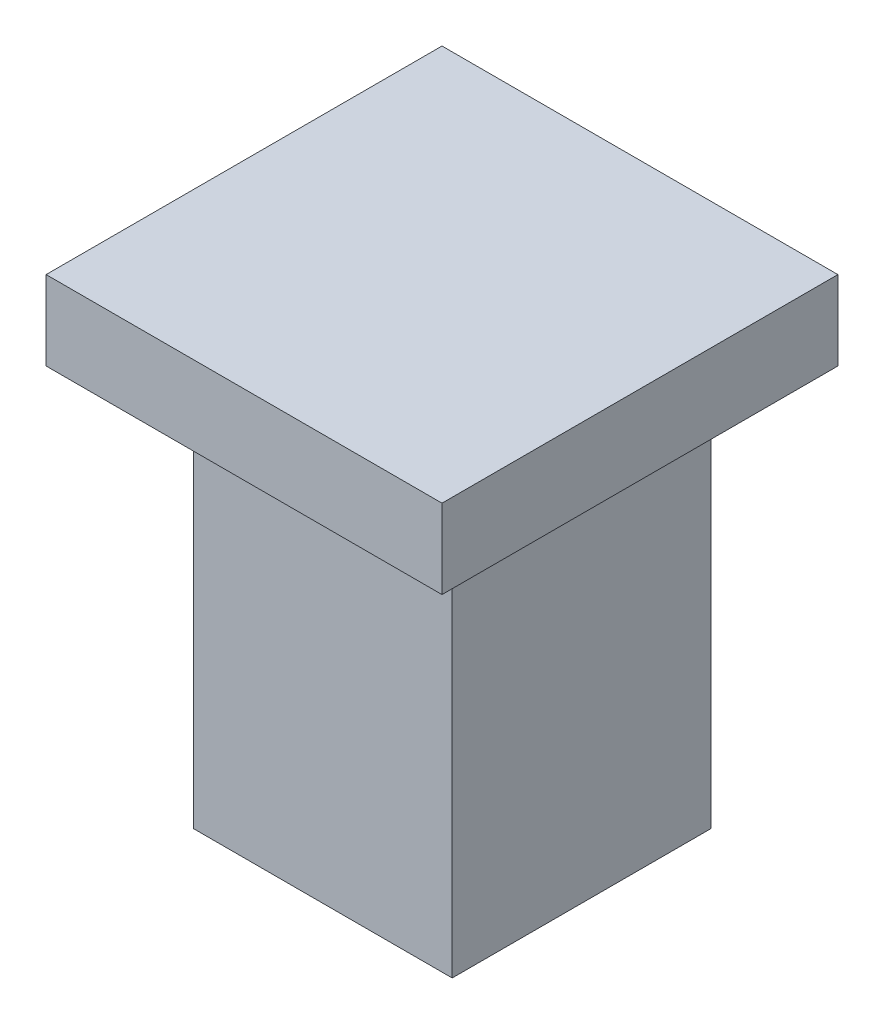
ISO-10303-21;
HEADER;
FILE_DESCRIPTION(('STEP AP214'),'2;1');
FILE_NAME('part.step','',(''),(''),'','','');
FILE_SCHEMA(('AUTOMOTIVE_DESIGN { 1 0 10303 214 1 1 1 1 }'));
ENDSEC;
DATA;
#1=APPLICATION_CONTEXT('core data for automotive mechanical design processes');
#2=APPLICATION_PROTOCOL_DEFINITION('international standard','automotive_design',2000,#1);
#3=PRODUCT_CONTEXT('',#1,'mechanical');
#4=PRODUCT('Part','Part','',(#3));
#5=PRODUCT_RELATED_PRODUCT_CATEGORY('part','',(#4));
#6=PRODUCT_DEFINITION_FORMATION('','',#4);
#7=PRODUCT_DEFINITION_CONTEXT('part definition',#1,'design');
#8=PRODUCT_DEFINITION('design','',#6,#7);
#9=PRODUCT_DEFINITION_SHAPE('','',#8);
#10=(LENGTH_UNIT() NAMED_UNIT(*) SI_UNIT(.MILLI.,.METRE.));
#11=(NAMED_UNIT(*) PLANE_ANGLE_UNIT() SI_UNIT($,.RADIAN.));
#12=(NAMED_UNIT(*) SI_UNIT($,.STERADIAN.) SOLID_ANGLE_UNIT());
#13=UNCERTAINTY_MEASURE_WITH_UNIT(LENGTH_MEASURE(1.E-05),#10,'distance_accuracy_value','');
#14=(GEOMETRIC_REPRESENTATION_CONTEXT(3) GLOBAL_UNCERTAINTY_ASSIGNED_CONTEXT((#13)) GLOBAL_UNIT_ASSIGNED_CONTEXT((#10,
#11,#12)) REPRESENTATION_CONTEXT('',''));
#15=CARTESIAN_POINT('',(0.,0.,0.));
#16=DIRECTION('',(0.,0.,1.));
#17=DIRECTION('',(1.,0.,0.));
#18=AXIS2_PLACEMENT_3D('',#15,#16,#17);
#19=CARTESIAN_POINT('',(4.9,15.,4.9));
#20=DIRECTION('',(-1.,0.,0.));
#21=DIRECTION('',(0.,0.,1.));
#22=AXIS2_PLACEMENT_3D('',#19,#20,#21);
#23=PLANE('',#22);
#24=DIRECTION('',(0.,0.,-1.));
#25=VECTOR('',#24,1.);
#26=CARTESIAN_POINT('',(4.9,0.,4.9));
#27=LINE('',#26,#25);
#28=CARTESIAN_POINT('',(4.9,0.,4.9));
#29=VERTEX_POINT('',#28);
#30=CARTESIAN_POINT('',(4.9,0.,-4.9));
#31=VERTEX_POINT('',#30);
#32=EDGE_CURVE('E147',#29,#31,#27,.T.);
#33=ORIENTED_EDGE('',*,*,#32,.T.);
#34=DIRECTION('',(0.,-1.,0.));
#35=VECTOR('',#34,1.);
#36=CARTESIAN_POINT('',(4.9,15.,-4.9));
#37=LINE('',#36,#35);
#38=CARTESIAN_POINT('',(4.9,15.,-4.9));
#39=VERTEX_POINT('',#38);
#40=EDGE_CURVE('E11',#39,#31,#37,.T.);
#41=ORIENTED_EDGE('',*,*,#40,.F.);
#42=DIRECTION('',(0.,0.,-1.));
#43=VECTOR('',#42,1.);
#44=CARTESIAN_POINT('',(4.9,15.,4.9));
#45=LINE('',#44,#43);
#46=CARTESIAN_POINT('',(4.9,15.,4.9));
#47=VERTEX_POINT('',#46);
#48=EDGE_CURVE('E158',#47,#39,#45,.T.);
#49=ORIENTED_EDGE('',*,*,#48,.F.);
#50=DIRECTION('',(0.,-1.,0.));
#51=VECTOR('',#50,1.);
#52=CARTESIAN_POINT('',(4.9,15.,4.9));
#53=LINE('',#52,#51);
#54=EDGE_CURVE('E171',#47,#29,#53,.T.);
#55=ORIENTED_EDGE('',*,*,#54,.T.);
#56=EDGE_LOOP('',(#33,#41,#49,#55));
#57=FACE_BOUND('',#56,.T.);
#58=ADVANCED_FACE('F45',(#57),#23,.F.);
#59=CARTESIAN_POINT('',(-4.9,15.,-4.9));
#60=DIRECTION('',(0.,0.,1.));
#61=DIRECTION('',(1.,0.,0.));
#62=AXIS2_PLACEMENT_3D('',#59,#60,#61);
#63=PLANE('',#62);
#64=DIRECTION('',(-1.,0.,0.));
#65=VECTOR('',#64,1.);
#66=CARTESIAN_POINT('',(-4.9,0.,-4.9));
#67=LINE('',#66,#65);
#68=CARTESIAN_POINT('',(-4.9,0.,-4.9));
#69=VERTEX_POINT('',#68);
#70=EDGE_CURVE('E152',#31,#69,#67,.T.);
#71=ORIENTED_EDGE('',*,*,#70,.T.);
#72=DIRECTION('',(0.,-1.,0.));
#73=VECTOR('',#72,1.);
#74=CARTESIAN_POINT('',(-4.9,15.,-4.9));
#75=LINE('',#74,#73);
#76=CARTESIAN_POINT('',(-4.9,15.,-4.9));
#77=VERTEX_POINT('',#76);
#78=EDGE_CURVE('E54',#77,#69,#75,.T.);
#79=ORIENTED_EDGE('',*,*,#78,.F.);
#80=DIRECTION('',(-1.,0.,0.));
#81=VECTOR('',#80,1.);
#82=CARTESIAN_POINT('',(-4.9,15.,-4.9));
#83=LINE('',#82,#81);
#84=EDGE_CURVE('E88',#39,#77,#83,.T.);
#85=ORIENTED_EDGE('',*,*,#84,.F.);
#86=ORIENTED_EDGE('',*,*,#40,.T.);
#87=EDGE_LOOP('',(#71,#79,#85,#86));
#88=FACE_BOUND('',#87,.T.);
#89=ADVANCED_FACE('F229',(#88),#63,.F.);
#90=CARTESIAN_POINT('',(-4.9,15.,4.9));
#91=DIRECTION('',(1.,0.,0.));
#92=DIRECTION('',(0.,0.,-1.));
#93=AXIS2_PLACEMENT_3D('',#90,#91,#92);
#94=PLANE('',#93);
#95=DIRECTION('',(0.,0.,1.));
#96=VECTOR('',#95,1.);
#97=CARTESIAN_POINT('',(-4.9,0.,4.9));
#98=LINE('',#97,#96);
#99=CARTESIAN_POINT('',(-4.9,0.,4.9));
#100=VERTEX_POINT('',#99);
#101=EDGE_CURVE('E78',#69,#100,#98,.T.);
#102=ORIENTED_EDGE('',*,*,#101,.T.);
#103=DIRECTION('',(0.,-1.,0.));
#104=VECTOR('',#103,1.);
#105=CARTESIAN_POINT('',(-4.9,15.,4.9));
#106=LINE('',#105,#104);
#107=CARTESIAN_POINT('',(-4.9,15.,4.9));
#108=VERTEX_POINT('',#107);
#109=EDGE_CURVE('E62',#108,#100,#106,.T.);
#110=ORIENTED_EDGE('',*,*,#109,.F.);
#111=DIRECTION('',(0.,0.,1.));
#112=VECTOR('',#111,1.);
#113=CARTESIAN_POINT('',(-4.9,15.,4.9));
#114=LINE('',#113,#112);
#115=EDGE_CURVE('E164',#77,#108,#114,.T.);
#116=ORIENTED_EDGE('',*,*,#115,.F.);
#117=ORIENTED_EDGE('',*,*,#78,.T.);
#118=EDGE_LOOP('',(#102,#110,#116,#117));
#119=FACE_BOUND('',#118,.T.);
#120=ADVANCED_FACE('F183',(#119),#94,.F.);
#121=CARTESIAN_POINT('',(-4.9,15.,4.9));
#122=DIRECTION('',(0.,0.,-1.));
#123=DIRECTION('',(-1.,0.,0.));
#124=AXIS2_PLACEMENT_3D('',#121,#122,#123);
#125=PLANE('',#124);
#126=DIRECTION('',(1.,0.,0.));
#127=VECTOR('',#126,1.);
#128=CARTESIAN_POINT('',(-4.9,0.,4.9));
#129=LINE('',#128,#127);
#130=EDGE_CURVE('E83',#100,#29,#129,.T.);
#131=ORIENTED_EDGE('',*,*,#130,.T.);
#132=ORIENTED_EDGE('',*,*,#54,.F.);
#133=DIRECTION('',(1.,0.,0.));
#134=VECTOR('',#133,1.);
#135=CARTESIAN_POINT('',(-4.9,15.,4.9));
#136=LINE('',#135,#134);
#137=EDGE_CURVE('E168',#108,#47,#136,.T.);
#138=ORIENTED_EDGE('',*,*,#137,.F.);
#139=ORIENTED_EDGE('',*,*,#109,.T.);
#140=EDGE_LOOP('',(#131,#132,#138,#139));
#141=FACE_BOUND('',#140,.T.);
#142=ADVANCED_FACE('F188',(#141),#125,.F.);
#143=CARTESIAN_POINT('',(0.,0.,0.));
#144=DIRECTION('',(0.,-1.,0.));
#145=DIRECTION('',(0.,0.,-1.));
#146=AXIS2_PLACEMENT_3D('',#143,#144,#145);
#147=PLANE('',#146);
#148=ORIENTED_EDGE('',*,*,#32,.F.);
#149=ORIENTED_EDGE('',*,*,#130,.F.);
#150=ORIENTED_EDGE('',*,*,#101,.F.);
#151=ORIENTED_EDGE('',*,*,#70,.F.);
#152=EDGE_LOOP('',(#148,#149,#150,#151));
#153=FACE_BOUND('',#152,.T.);
#154=ADVANCED_FACE('F186',(#153),#147,.T.);
#155=CARTESIAN_POINT('',(7.12590168214989,18.,7.51235203184051));
#156=DIRECTION('',(-1.,0.,0.));
#157=DIRECTION('',(0.,0.,1.));
#158=AXIS2_PLACEMENT_3D('',#155,#156,#157);
#159=PLANE('',#158);
#160=DIRECTION('',(0.,0.,-1.));
#161=VECTOR('',#160,1.);
#162=CARTESIAN_POINT('',(7.12590168214989,15.,7.51235203184051));
#163=LINE('',#162,#161);
#164=CARTESIAN_POINT('',(7.12590168214989,15.,7.51235203184051));
#165=VERTEX_POINT('',#164);
#166=CARTESIAN_POINT('',(7.12590168214989,15.,-7.48764796815949));
#167=VERTEX_POINT('',#166);
#168=EDGE_CURVE('E145',#165,#167,#163,.T.);
#169=ORIENTED_EDGE('',*,*,#168,.T.);
#170=DIRECTION('',(0.,-1.,0.));
#171=VECTOR('',#170,1.);
#172=CARTESIAN_POINT('',(7.12590168214989,18.,-7.48764796815949));
#173=LINE('',#172,#171);
#174=CARTESIAN_POINT('',(7.12590168214989,18.,-7.48764796815949));
#175=VERTEX_POINT('',#174);
#176=EDGE_CURVE('E123',#175,#167,#173,.T.);
#177=ORIENTED_EDGE('',*,*,#176,.F.);
#178=DIRECTION('',(0.,0.,-1.));
#179=VECTOR('',#178,1.);
#180=CARTESIAN_POINT('',(7.12590168214989,18.,7.51235203184051));
#181=LINE('',#180,#179);
#182=CARTESIAN_POINT('',(7.12590168214989,18.,7.51235203184051));
#183=VERTEX_POINT('',#182);
#184=EDGE_CURVE('E131',#183,#175,#181,.T.);
#185=ORIENTED_EDGE('',*,*,#184,.F.);
#186=DIRECTION('',(0.,-1.,0.));
#187=VECTOR('',#186,1.);
#188=CARTESIAN_POINT('',(7.12590168214989,18.,7.51235203184051));
#189=LINE('',#188,#187);
#190=EDGE_CURVE('E209',#183,#165,#189,.T.);
#191=ORIENTED_EDGE('',*,*,#190,.T.);
#192=EDGE_LOOP('',(#169,#177,#185,#191));
#193=FACE_BOUND('',#192,.T.);
#194=ADVANCED_FACE('F143',(#193),#159,.F.);
#195=CARTESIAN_POINT('',(-7.87409831785011,18.,-7.48764796815949));
#196=DIRECTION('',(0.,0.,1.));
#197=DIRECTION('',(1.,0.,0.));
#198=AXIS2_PLACEMENT_3D('',#195,#196,#197);
#199=PLANE('',#198);
#200=DIRECTION('',(-1.,0.,0.));
#201=VECTOR('',#200,1.);
#202=CARTESIAN_POINT('',(-7.87409831785011,15.,-7.48764796815949));
#203=LINE('',#202,#201);
#204=CARTESIAN_POINT('',(-7.87409831785011,15.,-7.48764796815949));
#205=VERTEX_POINT('',#204);
#206=EDGE_CURVE('E196',#167,#205,#203,.T.);
#207=ORIENTED_EDGE('',*,*,#206,.T.);
#208=DIRECTION('',(0.,-1.,0.));
#209=VECTOR('',#208,1.);
#210=CARTESIAN_POINT('',(-7.87409831785011,18.,-7.48764796815949));
#211=LINE('',#210,#209);
#212=CARTESIAN_POINT('',(-7.87409831785011,18.,-7.48764796815949));
#213=VERTEX_POINT('',#212);
#214=EDGE_CURVE('E126',#213,#205,#211,.T.);
#215=ORIENTED_EDGE('',*,*,#214,.F.);
#216=DIRECTION('',(-1.,0.,0.));
#217=VECTOR('',#216,1.);
#218=CARTESIAN_POINT('',(-7.87409831785011,18.,-7.48764796815949));
#219=LINE('',#218,#217);
#220=EDGE_CURVE('E119',#175,#213,#219,.T.);
#221=ORIENTED_EDGE('',*,*,#220,.F.);
#222=ORIENTED_EDGE('',*,*,#176,.T.);
#223=EDGE_LOOP('',(#207,#215,#221,#222));
#224=FACE_BOUND('',#223,.T.);
#225=ADVANCED_FACE('F121',(#224),#199,.F.);
#226=CARTESIAN_POINT('',(-7.87409831785011,18.,7.51235203184051));
#227=DIRECTION('',(1.,0.,0.));
#228=DIRECTION('',(0.,0.,-1.));
#229=AXIS2_PLACEMENT_3D('',#226,#227,#228);
#230=PLANE('',#229);
#231=DIRECTION('',(0.,0.,1.));
#232=VECTOR('',#231,1.);
#233=CARTESIAN_POINT('',(-7.87409831785011,15.,7.51235203184051));
#234=LINE('',#233,#232);
#235=CARTESIAN_POINT('',(-7.87409831785011,15.,7.51235203184051));
#236=VERTEX_POINT('',#235);
#237=EDGE_CURVE('E200',#205,#236,#234,.T.);
#238=ORIENTED_EDGE('',*,*,#237,.T.);
#239=DIRECTION('',(0.,-1.,0.));
#240=VECTOR('',#239,1.);
#241=CARTESIAN_POINT('',(-7.87409831785011,18.,7.51235203184051));
#242=LINE('',#241,#240);
#243=CARTESIAN_POINT('',(-7.87409831785011,18.,7.51235203184051));
#244=VERTEX_POINT('',#243);
#245=EDGE_CURVE('E154',#244,#236,#242,.T.);
#246=ORIENTED_EDGE('',*,*,#245,.F.);
#247=DIRECTION('',(0.,0.,1.));
#248=VECTOR('',#247,1.);
#249=CARTESIAN_POINT('',(-7.87409831785011,18.,7.51235203184051));
#250=LINE('',#249,#248);
#251=EDGE_CURVE('E130',#213,#244,#250,.T.);
#252=ORIENTED_EDGE('',*,*,#251,.F.);
#253=ORIENTED_EDGE('',*,*,#214,.T.);
#254=EDGE_LOOP('',(#238,#246,#252,#253));
#255=FACE_BOUND('',#254,.T.);
#256=ADVANCED_FACE('F217',(#255),#230,.F.);
#257=CARTESIAN_POINT('',(-7.87409831785011,18.,7.51235203184051));
#258=DIRECTION('',(0.,0.,-1.));
#259=DIRECTION('',(-1.,0.,0.));
#260=AXIS2_PLACEMENT_3D('',#257,#258,#259);
#261=PLANE('',#260);
#262=DIRECTION('',(1.,0.,0.));
#263=VECTOR('',#262,1.);
#264=CARTESIAN_POINT('',(-7.87409831785011,15.,7.51235203184051));
#265=LINE('',#264,#263);
#266=EDGE_CURVE('E141',#236,#165,#265,.T.);
#267=ORIENTED_EDGE('',*,*,#266,.T.);
#268=ORIENTED_EDGE('',*,*,#190,.F.);
#269=DIRECTION('',(1.,0.,0.));
#270=VECTOR('',#269,1.);
#271=CARTESIAN_POINT('',(-7.87409831785011,18.,7.51235203184051));
#272=LINE('',#271,#270);
#273=EDGE_CURVE('E136',#244,#183,#272,.T.);
#274=ORIENTED_EDGE('',*,*,#273,.F.);
#275=ORIENTED_EDGE('',*,*,#245,.T.);
#276=EDGE_LOOP('',(#267,#268,#274,#275));
#277=FACE_BOUND('',#276,.T.);
#278=ADVANCED_FACE('F215',(#277),#261,.F.);
#279=CARTESIAN_POINT('',(0.,18.,0.));
#280=DIRECTION('',(0.,-1.,0.));
#281=DIRECTION('',(0.,0.,-1.));
#282=AXIS2_PLACEMENT_3D('',#279,#280,#281);
#283=PLANE('',#282);
#284=ORIENTED_EDGE('',*,*,#184,.T.);
#285=ORIENTED_EDGE('',*,*,#220,.T.);
#286=ORIENTED_EDGE('',*,*,#251,.T.);
#287=ORIENTED_EDGE('',*,*,#273,.T.);
#288=EDGE_LOOP('',(#284,#285,#286,#287));
#289=FACE_BOUND('',#288,.T.);
#290=ADVANCED_FACE('F134',(#289),#283,.F.);
#291=CARTESIAN_POINT('',(0.,15.,0.));
#292=DIRECTION('',(0.,-1.,0.));
#293=DIRECTION('',(0.,0.,-1.));
#294=AXIS2_PLACEMENT_3D('',#291,#292,#293);
#295=PLANE('',#294);
#296=ORIENTED_EDGE('',*,*,#137,.T.);
#297=ORIENTED_EDGE('',*,*,#48,.T.);
#298=ORIENTED_EDGE('',*,*,#84,.T.);
#299=ORIENTED_EDGE('',*,*,#115,.T.);
#300=EDGE_LOOP('',(#296,#297,#298,#299));
#301=FACE_BOUND('',#300,.T.);
#302=ORIENTED_EDGE('',*,*,#168,.F.);
#303=ORIENTED_EDGE('',*,*,#266,.F.);
#304=ORIENTED_EDGE('',*,*,#237,.F.);
#305=ORIENTED_EDGE('',*,*,#206,.F.);
#306=EDGE_LOOP('',(#302,#303,#304,#305));
#307=FACE_BOUND('',#306,.T.);
#308=ADVANCED_FACE('F190',(#301,#307),#295,.T.);
#309=CLOSED_SHELL('',(#58,#89,#120,#142,#154,#194,#225,#256,#278,#290,#308));
#310=MANIFOLD_SOLID_BREP('B2',#309);
#311=ADVANCED_BREP_SHAPE_REPRESENTATION('',(#18,#310),#14);
#312=SHAPE_DEFINITION_REPRESENTATION(#9,#311);
ENDSEC;
END-ISO-10303-21;
